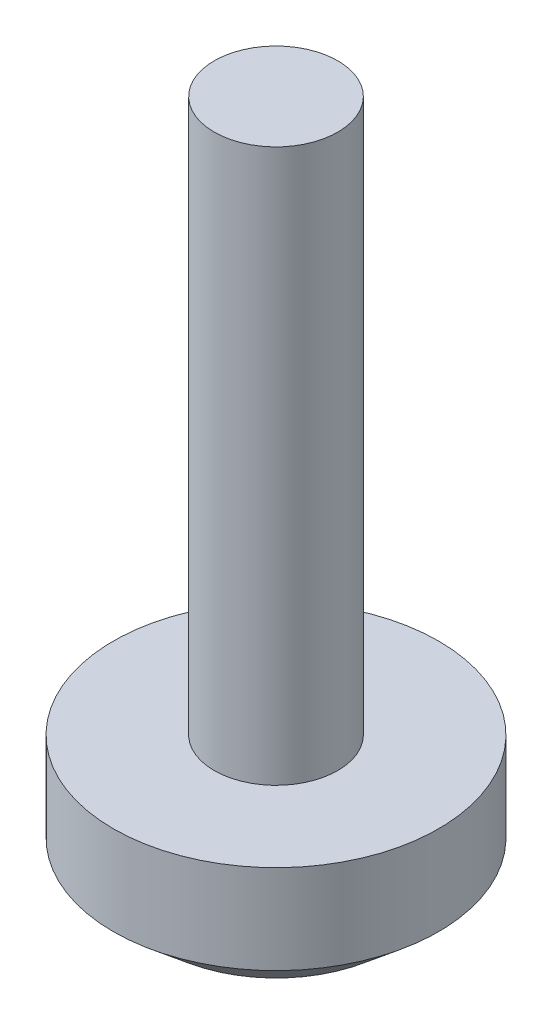
ISO-10303-21;
HEADER;
FILE_DESCRIPTION(('STEP AP214'),'2;1');
FILE_NAME('part.step','',(''),(''),'','','');
FILE_SCHEMA(('AUTOMOTIVE_DESIGN { 1 0 10303 214 1 1 1 1 }'));
ENDSEC;
DATA;
#1=APPLICATION_CONTEXT('core data for automotive mechanical design processes');
#2=APPLICATION_PROTOCOL_DEFINITION('international standard','automotive_design',2000,#1);
#3=PRODUCT_CONTEXT('',#1,'mechanical');
#4=PRODUCT('Part','Part','',(#3));
#5=PRODUCT_RELATED_PRODUCT_CATEGORY('part','',(#4));
#6=PRODUCT_DEFINITION_FORMATION('','',#4);
#7=PRODUCT_DEFINITION_CONTEXT('part definition',#1,'design');
#8=PRODUCT_DEFINITION('design','',#6,#7);
#9=PRODUCT_DEFINITION_SHAPE('','',#8);
#10=(LENGTH_UNIT() NAMED_UNIT(*) SI_UNIT(.MILLI.,.METRE.));
#11=(NAMED_UNIT(*) PLANE_ANGLE_UNIT() SI_UNIT($,.RADIAN.));
#12=(NAMED_UNIT(*) SI_UNIT($,.STERADIAN.) SOLID_ANGLE_UNIT());
#13=UNCERTAINTY_MEASURE_WITH_UNIT(LENGTH_MEASURE(1.E-05),#10,'distance_accuracy_value','');
#14=(GEOMETRIC_REPRESENTATION_CONTEXT(3) GLOBAL_UNCERTAINTY_ASSIGNED_CONTEXT((#13)) GLOBAL_UNIT_ASSIGNED_CONTEXT((#10,
#11,#12)) REPRESENTATION_CONTEXT('',''));
#15=CARTESIAN_POINT('',(0.,0.,0.));
#16=DIRECTION('',(0.,0.,1.));
#17=DIRECTION('',(1.,0.,0.));
#18=AXIS2_PLACEMENT_3D('',#15,#16,#17);
#19=CARTESIAN_POINT('',(0.,4.,0.));
#20=DIRECTION('',(0.,-1.,0.));
#21=DIRECTION('',(0.,0.,-1.));
#22=AXIS2_PLACEMENT_3D('',#19,#20,#21);
#23=CYLINDRICAL_SURFACE('',#22,5.);
#24=CARTESIAN_POINT('',(0.,1.25864944676592,0.));
#25=DIRECTION('',(0.,1.,0.));
#26=DIRECTION('',(0.,0.,1.));
#27=AXIS2_PLACEMENT_3D('',#24,#25,#26);
#28=CIRCLE('',#27,5.);
#29=CARTESIAN_POINT('',(0.,1.25864944676592,5.));
#30=VERTEX_POINT('',#29);
#31=EDGE_CURVE('E52',#30,#30,#28,.T.);
#32=ORIENTED_EDGE('',*,*,#31,.T.);
#33=EDGE_LOOP('',(#32));
#34=FACE_BOUND('',#33,.T.);
#35=CARTESIAN_POINT('',(0.,4.,0.));
#36=DIRECTION('',(0.,1.,0.));
#37=DIRECTION('',(0.,0.,1.));
#38=AXIS2_PLACEMENT_3D('',#35,#36,#37);
#39=CIRCLE('',#38,5.);
#40=CARTESIAN_POINT('',(0.,4.,5.));
#41=VERTEX_POINT('',#40);
#42=EDGE_CURVE('E61',#41,#41,#39,.T.);
#43=ORIENTED_EDGE('',*,*,#42,.F.);
#44=EDGE_LOOP('',(#43));
#45=FACE_BOUND('',#44,.T.);
#46=ADVANCED_FACE('F44',(#34,#45),#23,.T.);
#47=CARTESIAN_POINT('',(0.,4.,0.));
#48=DIRECTION('',(0.,1.,0.));
#49=DIRECTION('',(0.,0.,1.));
#50=AXIS2_PLACEMENT_3D('',#47,#48,#49);
#51=PLANE('',#50);
#52=CARTESIAN_POINT('',(0.,4.,0.));
#53=DIRECTION('',(0.,1.,0.));
#54=DIRECTION('',(0.,0.,1.));
#55=AXIS2_PLACEMENT_3D('',#52,#53,#54);
#56=CIRCLE('',#55,1.9);
#57=CARTESIAN_POINT('',(0.,4.,1.9));
#58=VERTEX_POINT('',#57);
#59=EDGE_CURVE('E60',#58,#58,#56,.T.);
#60=ORIENTED_EDGE('',*,*,#59,.F.);
#61=EDGE_LOOP('',(#60));
#62=FACE_BOUND('',#61,.T.);
#63=ORIENTED_EDGE('',*,*,#42,.T.);
#64=EDGE_LOOP('',(#63));
#65=FACE_BOUND('',#64,.T.);
#66=ADVANCED_FACE('F78',(#62,#65),#51,.T.);
#67=CARTESIAN_POINT('',(0.,0.,0.));
#68=DIRECTION('',(0.,1.,0.));
#69=DIRECTION('',(0.,0.,1.));
#70=AXIS2_PLACEMENT_3D('',#67,#68,#69);
#71=PLANE('',#70);
#72=CARTESIAN_POINT('',(0.,0.,0.));
#73=DIRECTION('',(0.,1.,0.));
#74=DIRECTION('',(0.,0.,1.));
#75=AXIS2_PLACEMENT_3D('',#72,#73,#74);
#76=CIRCLE('',#75,3.49999999999999);
#77=CARTESIAN_POINT('',(0.,0.,3.49999999999999));
#78=VERTEX_POINT('',#77);
#79=EDGE_CURVE('E10',#78,#78,#76,.F.);
#80=ORIENTED_EDGE('',*,*,#79,.T.);
#81=EDGE_LOOP('',(#80));
#82=FACE_BOUND('',#81,.T.);
#83=ADVANCED_FACE('F73',(#82),#71,.F.);
#84=CARTESIAN_POINT('',(0.,21.,0.));
#85=DIRECTION('',(0.,-1.,0.));
#86=DIRECTION('',(0.,0.,-1.));
#87=AXIS2_PLACEMENT_3D('',#84,#85,#86);
#88=CYLINDRICAL_SURFACE('',#87,1.9);
#89=CARTESIAN_POINT('',(0.,21.,0.));
#90=DIRECTION('',(0.,1.,0.));
#91=DIRECTION('',(0.,0.,1.));
#92=AXIS2_PLACEMENT_3D('',#89,#90,#91);
#93=CIRCLE('',#92,1.9);
#94=CARTESIAN_POINT('',(0.,21.,1.9));
#95=VERTEX_POINT('',#94);
#96=EDGE_CURVE('E64',#95,#95,#93,.T.);
#97=ORIENTED_EDGE('',*,*,#96,.F.);
#98=EDGE_LOOP('',(#97));
#99=FACE_BOUND('',#98,.T.);
#100=ORIENTED_EDGE('',*,*,#59,.T.);
#101=EDGE_LOOP('',(#100));
#102=FACE_BOUND('',#101,.T.);
#103=ADVANCED_FACE('F75',(#99,#102),#88,.T.);
#104=CARTESIAN_POINT('',(0.,21.,0.));
#105=DIRECTION('',(0.,1.,0.));
#106=DIRECTION('',(0.,0.,1.));
#107=AXIS2_PLACEMENT_3D('',#104,#105,#106);
#108=PLANE('',#107);
#109=ORIENTED_EDGE('',*,*,#96,.T.);
#110=EDGE_LOOP('',(#109));
#111=FACE_BOUND('',#110,.T.);
#112=ADVANCED_FACE('F66',(#111),#108,.T.);
#113=CARTESIAN_POINT('',(0.,1.25864944676592,0.));
#114=DIRECTION('',(0.,1.,0.));
#115=DIRECTION('',(0.,0.,1.));
#116=AXIS2_PLACEMENT_3D('',#113,#114,#115);
#117=CONICAL_SURFACE('',#116,5.,0.872664625997167);
#118=ORIENTED_EDGE('',*,*,#79,.F.);
#119=EDGE_LOOP('',(#118));
#120=FACE_BOUND('',#119,.T.);
#121=ORIENTED_EDGE('',*,*,#31,.F.);
#122=EDGE_LOOP('',(#121));
#123=FACE_BOUND('',#122,.T.);
#124=ADVANCED_FACE('F48',(#120,#123),#117,.T.);
#125=CLOSED_SHELL('',(#46,#66,#83,#103,#112,#124));
#126=MANIFOLD_SOLID_BREP('B2',#125);
#127=ADVANCED_BREP_SHAPE_REPRESENTATION('',(#18,#126),#14);
#128=SHAPE_DEFINITION_REPRESENTATION(#9,#127);
ENDSEC;
END-ISO-10303-21;
